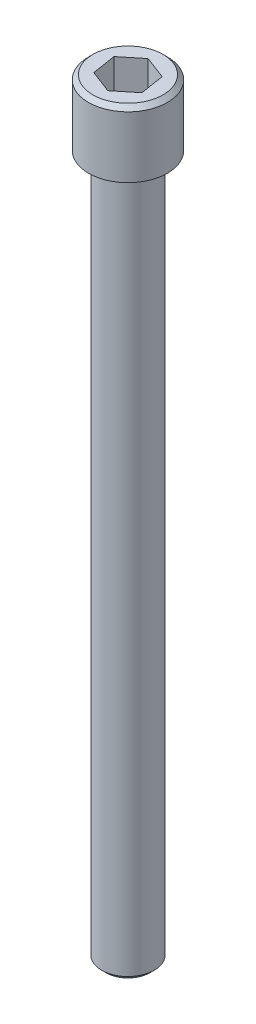
ISO-10303-21;
HEADER;
FILE_DESCRIPTION(('STEP AP214'),'2;1');
FILE_NAME('part.step','',(''),(''),'','','');
FILE_SCHEMA(('AUTOMOTIVE_DESIGN { 1 0 10303 214 1 1 1 1 }'));
ENDSEC;
DATA;
#1=APPLICATION_CONTEXT('core data for automotive mechanical design processes');
#2=APPLICATION_PROTOCOL_DEFINITION('international standard','automotive_design',2000,#1);
#3=PRODUCT_CONTEXT('',#1,'mechanical');
#4=PRODUCT('Part','Part','',(#3));
#5=PRODUCT_RELATED_PRODUCT_CATEGORY('part','',(#4));
#6=PRODUCT_DEFINITION_FORMATION('','',#4);
#7=PRODUCT_DEFINITION_CONTEXT('part definition',#1,'design');
#8=PRODUCT_DEFINITION('design','',#6,#7);
#9=PRODUCT_DEFINITION_SHAPE('','',#8);
#10=(LENGTH_UNIT() NAMED_UNIT(*) SI_UNIT(.MILLI.,.METRE.));
#11=(NAMED_UNIT(*) PLANE_ANGLE_UNIT() SI_UNIT($,.RADIAN.));
#12=(NAMED_UNIT(*) SI_UNIT($,.STERADIAN.) SOLID_ANGLE_UNIT());
#13=UNCERTAINTY_MEASURE_WITH_UNIT(LENGTH_MEASURE(1.E-05),#10,'distance_accuracy_value','');
#14=(GEOMETRIC_REPRESENTATION_CONTEXT(3) GLOBAL_UNCERTAINTY_ASSIGNED_CONTEXT((#13)) GLOBAL_UNIT_ASSIGNED_CONTEXT((#10,
#11,#12)) REPRESENTATION_CONTEXT('',''));
#15=CARTESIAN_POINT('',(0.,0.,0.));
#16=DIRECTION('',(0.,0.,1.));
#17=DIRECTION('',(1.,0.,0.));
#18=AXIS2_PLACEMENT_3D('',#15,#16,#17);
#19=CARTESIAN_POINT('',(0.,40.,0.));
#20=DIRECTION('',(0.,-1.,0.));
#21=DIRECTION('',(0.,0.,-1.));
#22=AXIS2_PLACEMENT_3D('',#19,#20,#21);
#23=CYLINDRICAL_SURFACE('',#22,1.5);
#24=CARTESIAN_POINT('',(0.,0.25,0.));
#25=DIRECTION('',(0.,1.,0.));
#26=DIRECTION('',(0.,0.,1.));
#27=AXIS2_PLACEMENT_3D('',#24,#25,#26);
#28=CIRCLE('',#27,1.5);
#29=CARTESIAN_POINT('',(0.,0.25,1.5));
#30=VERTEX_POINT('',#29);
#31=EDGE_CURVE('E41',#30,#30,#28,.T.);
#32=ORIENTED_EDGE('',*,*,#31,.T.);
#33=EDGE_LOOP('',(#32));
#34=FACE_BOUND('',#33,.T.);
#35=CARTESIAN_POINT('',(0.,40.,0.));
#36=DIRECTION('',(0.,1.,0.));
#37=DIRECTION('',(0.,0.,1.));
#38=AXIS2_PLACEMENT_3D('',#35,#36,#37);
#39=CIRCLE('',#38,1.5);
#40=CARTESIAN_POINT('',(0.,40.,1.5));
#41=VERTEX_POINT('',#40);
#42=EDGE_CURVE('E143',#41,#41,#39,.T.);
#43=ORIENTED_EDGE('',*,*,#42,.F.);
#44=EDGE_LOOP('',(#43));
#45=FACE_BOUND('',#44,.T.);
#46=ADVANCED_FACE('F33',(#34,#45),#23,.T.);
#47=CARTESIAN_POINT('',(0.,0.,0.));
#48=DIRECTION('',(0.,1.,0.));
#49=DIRECTION('',(0.,0.,1.));
#50=AXIS2_PLACEMENT_3D('',#47,#48,#49);
#51=PLANE('',#50);
#52=CARTESIAN_POINT('',(0.,0.,0.));
#53=DIRECTION('',(0.,1.,0.));
#54=DIRECTION('',(0.,0.,1.));
#55=AXIS2_PLACEMENT_3D('',#52,#53,#54);
#56=CIRCLE('',#55,1.24999999999999);
#57=CARTESIAN_POINT('',(0.,0.,1.24999999999999));
#58=VERTEX_POINT('',#57);
#59=EDGE_CURVE('E11',#58,#58,#56,.F.);
#60=ORIENTED_EDGE('',*,*,#59,.T.);
#61=EDGE_LOOP('',(#60));
#62=FACE_BOUND('',#61,.T.);
#63=ADVANCED_FACE('F165',(#62),#51,.F.);
#64=CARTESIAN_POINT('',(0.,43.75,0.));
#65=DIRECTION('',(0.,-1.,0.));
#66=DIRECTION('',(0.,0.,-1.));
#67=AXIS2_PLACEMENT_3D('',#64,#65,#66);
#68=CYLINDRICAL_SURFACE('',#67,2.25);
#69=CARTESIAN_POINT('',(0.,43.5,0.));
#70=DIRECTION('',(0.,1.,0.));
#71=DIRECTION('',(0.,0.,1.));
#72=AXIS2_PLACEMENT_3D('',#69,#70,#71);
#73=CIRCLE('',#72,2.25);
#74=CARTESIAN_POINT('',(0.,43.5,2.25));
#75=VERTEX_POINT('',#74);
#76=EDGE_CURVE('E149',#75,#75,#73,.F.);
#77=ORIENTED_EDGE('',*,*,#76,.T.);
#78=EDGE_LOOP('',(#77));
#79=FACE_BOUND('',#78,.T.);
#80=CARTESIAN_POINT('',(0.,40.,0.));
#81=DIRECTION('',(0.,1.,0.));
#82=DIRECTION('',(0.,0.,1.));
#83=AXIS2_PLACEMENT_3D('',#80,#81,#82);
#84=CIRCLE('',#83,2.25);
#85=CARTESIAN_POINT('',(0.,40.,2.25));
#86=VERTEX_POINT('',#85);
#87=EDGE_CURVE('E135',#86,#86,#84,.T.);
#88=ORIENTED_EDGE('',*,*,#87,.T.);
#89=EDGE_LOOP('',(#88));
#90=FACE_BOUND('',#89,.T.);
#91=ADVANCED_FACE('F170',(#79,#90),#68,.T.);
#92=CARTESIAN_POINT('',(0.,43.75,0.));
#93=DIRECTION('',(0.,1.,0.));
#94=DIRECTION('',(0.,0.,1.));
#95=AXIS2_PLACEMENT_3D('',#92,#93,#94);
#96=PLANE('',#95);
#97=CARTESIAN_POINT('',(0.,43.75,0.));
#98=DIRECTION('',(0.,1.,0.));
#99=DIRECTION('',(0.,0.,1.));
#100=AXIS2_PLACEMENT_3D('',#97,#98,#99);
#101=CIRCLE('',#100,2.00000000000001);
#102=CARTESIAN_POINT('',(0.,43.75,2.00000000000001));
#103=VERTEX_POINT('',#102);
#104=EDGE_CURVE('E146',#103,#103,#101,.T.);
#105=ORIENTED_EDGE('',*,*,#104,.T.);
#106=EDGE_LOOP('',(#105));
#107=FACE_BOUND('',#106,.T.);
#108=DIRECTION('',(0.159195520088402,0.,0.987247074639263));
#109=VECTOR('',#108,1.);
#110=CARTESIAN_POINT('',(-1.2949903812193,43.75,-0.492950213053497));
#111=LINE('',#110,#109);
#112=CARTESIAN_POINT('',(-1.2949903812193,43.75,-0.492950213053497));
#113=VERTEX_POINT('',#112);
#114=CARTESIAN_POINT('',(-1.07440259791493,43.75,0.875019461265662));
#115=VERTEX_POINT('',#114);
#116=EDGE_CURVE('E48',#113,#115,#111,.T.);
#117=ORIENTED_EDGE('',*,*,#116,.F.);
#118=DIRECTION('',(-0.775383286405273,0.,0.631490901884864));
#119=VECTOR('',#118,1.);
#120=CARTESIAN_POINT('',(-0.220587783304371,43.75,-1.36796967431916));
#121=LINE('',#120,#119);
#122=CARTESIAN_POINT('',(-0.220587783304371,43.75,-1.36796967431916));
#123=VERTEX_POINT('',#122);
#124=EDGE_CURVE('E131',#123,#113,#121,.T.);
#125=ORIENTED_EDGE('',*,*,#124,.F.);
#126=DIRECTION('',(-0.934578806493675,0.,-0.3557561727544));
#127=VECTOR('',#126,1.);
#128=CARTESIAN_POINT('',(1.07440259791493,43.75,-0.875019461265662));
#129=LINE('',#128,#127);
#130=CARTESIAN_POINT('',(1.07440259791493,43.75,-0.875019461265662));
#131=VERTEX_POINT('',#130);
#132=EDGE_CURVE('E129',#131,#123,#129,.T.);
#133=ORIENTED_EDGE('',*,*,#132,.F.);
#134=DIRECTION('',(-0.159195520088402,0.,-0.987247074639263));
#135=VECTOR('',#134,1.);
#136=CARTESIAN_POINT('',(1.2949903812193,43.75,0.492950213053496));
#137=LINE('',#136,#135);
#138=CARTESIAN_POINT('',(1.2949903812193,43.75,0.492950213053496));
#139=VERTEX_POINT('',#138);
#140=EDGE_CURVE('E96',#139,#131,#137,.T.);
#141=ORIENTED_EDGE('',*,*,#140,.F.);
#142=DIRECTION('',(0.775383286405273,0.,-0.631490901884864));
#143=VECTOR('',#142,1.);
#144=CARTESIAN_POINT('',(0.220587783304371,43.75,1.36796967431916));
#145=LINE('',#144,#143);
#146=CARTESIAN_POINT('',(0.220587783304371,43.75,1.36796967431916));
#147=VERTEX_POINT('',#146);
#148=EDGE_CURVE('E125',#147,#139,#145,.T.);
#149=ORIENTED_EDGE('',*,*,#148,.F.);
#150=DIRECTION('',(0.934578806493675,0.,0.3557561727544));
#151=VECTOR('',#150,1.);
#152=CARTESIAN_POINT('',(-1.07440259791493,43.75,0.875019461265662));
#153=LINE('',#152,#151);
#154=EDGE_CURVE('E122',#115,#147,#153,.T.);
#155=ORIENTED_EDGE('',*,*,#154,.F.);
#156=EDGE_LOOP('',(#117,#125,#133,#141,#149,#155));
#157=FACE_BOUND('',#156,.T.);
#158=ADVANCED_FACE('F176',(#107,#157),#96,.T.);
#159=CARTESIAN_POINT('',(0.,40.,0.));
#160=DIRECTION('',(0.,1.,0.));
#161=DIRECTION('',(0.,0.,1.));
#162=AXIS2_PLACEMENT_3D('',#159,#160,#161);
#163=PLANE('',#162);
#164=ORIENTED_EDGE('',*,*,#42,.T.);
#165=EDGE_LOOP('',(#164));
#166=FACE_BOUND('',#165,.T.);
#167=ORIENTED_EDGE('',*,*,#87,.F.);
#168=EDGE_LOOP('',(#167));
#169=FACE_BOUND('',#168,.T.);
#170=ADVANCED_FACE('F178',(#166,#169),#163,.F.);
#171=CARTESIAN_POINT('',(-1.2949903812193,41.5,-0.492950213053497));
#172=DIRECTION('',(-0.987247074639263,0.,0.159195520088402));
#173=DIRECTION('',(0.159195520088402,0.,0.987247074639263));
#174=AXIS2_PLACEMENT_3D('',#171,#172,#173);
#175=PLANE('',#174);
#176=ORIENTED_EDGE('',*,*,#116,.T.);
#177=DIRECTION('',(0.,1.,0.));
#178=VECTOR('',#177,1.);
#179=CARTESIAN_POINT('',(-1.07440259791493,41.5,0.875019461265662));
#180=LINE('',#179,#178);
#181=CARTESIAN_POINT('',(-1.07440259791493,41.5,0.875019461265662));
#182=VERTEX_POINT('',#181);
#183=EDGE_CURVE('E78',#182,#115,#180,.T.);
#184=ORIENTED_EDGE('',*,*,#183,.F.);
#185=DIRECTION('',(0.159195520088402,0.,0.987247074639263));
#186=VECTOR('',#185,1.);
#187=CARTESIAN_POINT('',(-1.2949903812193,41.5,-0.492950213053497));
#188=LINE('',#187,#186);
#189=CARTESIAN_POINT('',(-1.2949903812193,41.5,-0.492950213053497));
#190=VERTEX_POINT('',#189);
#191=EDGE_CURVE('E133',#190,#182,#188,.T.);
#192=ORIENTED_EDGE('',*,*,#191,.F.);
#193=DIRECTION('',(0.,1.,0.));
#194=VECTOR('',#193,1.);
#195=CARTESIAN_POINT('',(-1.2949903812193,41.5,-0.492950213053497));
#196=LINE('',#195,#194);
#197=EDGE_CURVE('E56',#190,#113,#196,.T.);
#198=ORIENTED_EDGE('',*,*,#197,.T.);
#199=EDGE_LOOP('',(#176,#184,#192,#198));
#200=FACE_BOUND('',#199,.T.);
#201=ADVANCED_FACE('F181',(#200),#175,.F.);
#202=CARTESIAN_POINT('',(-0.220587783304371,41.5,-1.36796967431916));
#203=DIRECTION('',(-0.631490901884864,0.,-0.775383286405273));
#204=DIRECTION('',(-0.775383286405273,0.,0.631490901884864));
#205=AXIS2_PLACEMENT_3D('',#202,#203,#204);
#206=PLANE('',#205);
#207=ORIENTED_EDGE('',*,*,#124,.T.);
#208=ORIENTED_EDGE('',*,*,#197,.F.);
#209=DIRECTION('',(-0.775383286405273,0.,0.631490901884864));
#210=VECTOR('',#209,1.);
#211=CARTESIAN_POINT('',(-0.220587783304371,41.5,-1.36796967431916));
#212=LINE('',#211,#210);
#213=CARTESIAN_POINT('',(-0.220587783304371,41.5,-1.36796967431916));
#214=VERTEX_POINT('',#213);
#215=EDGE_CURVE('E108',#214,#190,#212,.T.);
#216=ORIENTED_EDGE('',*,*,#215,.F.);
#217=DIRECTION('',(0.,1.,0.));
#218=VECTOR('',#217,1.);
#219=CARTESIAN_POINT('',(-0.220587783304371,41.5,-1.36796967431916));
#220=LINE('',#219,#218);
#221=EDGE_CURVE('E100',#214,#123,#220,.T.);
#222=ORIENTED_EDGE('',*,*,#221,.T.);
#223=EDGE_LOOP('',(#207,#208,#216,#222));
#224=FACE_BOUND('',#223,.T.);
#225=ADVANCED_FACE('F188',(#224),#206,.F.);
#226=CARTESIAN_POINT('',(1.07440259791493,41.5,-0.875019461265662));
#227=DIRECTION('',(0.3557561727544,0.,-0.934578806493675));
#228=DIRECTION('',(-0.934578806493675,0.,-0.3557561727544));
#229=AXIS2_PLACEMENT_3D('',#226,#227,#228);
#230=PLANE('',#229);
#231=ORIENTED_EDGE('',*,*,#132,.T.);
#232=ORIENTED_EDGE('',*,*,#221,.F.);
#233=DIRECTION('',(-0.934578806493675,0.,-0.3557561727544));
#234=VECTOR('',#233,1.);
#235=CARTESIAN_POINT('',(1.07440259791493,41.5,-0.875019461265662));
#236=LINE('',#235,#234);
#237=CARTESIAN_POINT('',(1.07440259791493,41.5,-0.875019461265662));
#238=VERTEX_POINT('',#237);
#239=EDGE_CURVE('E104',#238,#214,#236,.T.);
#240=ORIENTED_EDGE('',*,*,#239,.F.);
#241=DIRECTION('',(0.,1.,0.));
#242=VECTOR('',#241,1.);
#243=CARTESIAN_POINT('',(1.07440259791493,41.5,-0.875019461265662));
#244=LINE('',#243,#242);
#245=EDGE_CURVE('E89',#238,#131,#244,.T.);
#246=ORIENTED_EDGE('',*,*,#245,.T.);
#247=EDGE_LOOP('',(#231,#232,#240,#246));
#248=FACE_BOUND('',#247,.T.);
#249=ADVANCED_FACE('F105',(#248),#230,.F.);
#250=CARTESIAN_POINT('',(1.2949903812193,41.5,0.492950213053496));
#251=DIRECTION('',(0.987247074639263,0.,-0.159195520088402));
#252=DIRECTION('',(-0.159195520088403,0.,-0.987247074639263));
#253=AXIS2_PLACEMENT_3D('',#250,#251,#252);
#254=PLANE('',#253);
#255=ORIENTED_EDGE('',*,*,#140,.T.);
#256=ORIENTED_EDGE('',*,*,#245,.F.);
#257=DIRECTION('',(-0.159195520088402,0.,-0.987247074639263));
#258=VECTOR('',#257,1.);
#259=CARTESIAN_POINT('',(1.2949903812193,41.5,0.492950213053496));
#260=LINE('',#259,#258);
#261=CARTESIAN_POINT('',(1.2949903812193,41.5,0.492950213053496));
#262=VERTEX_POINT('',#261);
#263=EDGE_CURVE('E93',#262,#238,#260,.T.);
#264=ORIENTED_EDGE('',*,*,#263,.F.);
#265=DIRECTION('',(0.,1.,0.));
#266=VECTOR('',#265,1.);
#267=CARTESIAN_POINT('',(1.2949903812193,41.5,0.492950213053496));
#268=LINE('',#267,#266);
#269=EDGE_CURVE('E101',#262,#139,#268,.T.);
#270=ORIENTED_EDGE('',*,*,#269,.T.);
#271=EDGE_LOOP('',(#255,#256,#264,#270));
#272=FACE_BOUND('',#271,.T.);
#273=ADVANCED_FACE('F91',(#272),#254,.F.);
#274=CARTESIAN_POINT('',(0.220587783304371,41.5,1.36796967431916));
#275=DIRECTION('',(0.631490901884864,0.,0.775383286405273));
#276=DIRECTION('',(0.775383286405273,0.,-0.631490901884864));
#277=AXIS2_PLACEMENT_3D('',#274,#275,#276);
#278=PLANE('',#277);
#279=ORIENTED_EDGE('',*,*,#148,.T.);
#280=ORIENTED_EDGE('',*,*,#269,.F.);
#281=DIRECTION('',(0.775383286405273,0.,-0.631490901884864));
#282=VECTOR('',#281,1.);
#283=CARTESIAN_POINT('',(0.220587783304371,41.5,1.36796967431916));
#284=LINE('',#283,#282);
#285=CARTESIAN_POINT('',(0.220587783304371,41.5,1.36796967431916));
#286=VERTEX_POINT('',#285);
#287=EDGE_CURVE('E114',#286,#262,#284,.T.);
#288=ORIENTED_EDGE('',*,*,#287,.F.);
#289=DIRECTION('',(0.,1.,0.));
#290=VECTOR('',#289,1.);
#291=CARTESIAN_POINT('',(0.220587783304371,41.5,1.36796967431916));
#292=LINE('',#291,#290);
#293=EDGE_CURVE('E138',#286,#147,#292,.T.);
#294=ORIENTED_EDGE('',*,*,#293,.T.);
#295=EDGE_LOOP('',(#279,#280,#288,#294));
#296=FACE_BOUND('',#295,.T.);
#297=ADVANCED_FACE('F192',(#296),#278,.F.);
#298=CARTESIAN_POINT('',(-1.07440259791493,41.5,0.875019461265662));
#299=DIRECTION('',(-0.3557561727544,0.,0.934578806493675));
#300=DIRECTION('',(0.934578806493675,0.,0.3557561727544));
#301=AXIS2_PLACEMENT_3D('',#298,#299,#300);
#302=PLANE('',#301);
#303=ORIENTED_EDGE('',*,*,#154,.T.);
#304=ORIENTED_EDGE('',*,*,#293,.F.);
#305=DIRECTION('',(0.934578806493675,0.,0.3557561727544));
#306=VECTOR('',#305,1.);
#307=CARTESIAN_POINT('',(-1.07440259791493,41.5,0.875019461265662));
#308=LINE('',#307,#306);
#309=EDGE_CURVE('E116',#182,#286,#308,.T.);
#310=ORIENTED_EDGE('',*,*,#309,.F.);
#311=ORIENTED_EDGE('',*,*,#183,.T.);
#312=EDGE_LOOP('',(#303,#304,#310,#311));
#313=FACE_BOUND('',#312,.T.);
#314=ADVANCED_FACE('F189',(#313),#302,.F.);
#315=CARTESIAN_POINT('',(0.,41.5,0.));
#316=DIRECTION('',(0.,1.,0.));
#317=DIRECTION('',(0.,0.,1.));
#318=AXIS2_PLACEMENT_3D('',#315,#316,#317);
#319=PLANE('',#318);
#320=ORIENTED_EDGE('',*,*,#191,.T.);
#321=ORIENTED_EDGE('',*,*,#309,.T.);
#322=ORIENTED_EDGE('',*,*,#287,.T.);
#323=ORIENTED_EDGE('',*,*,#263,.T.);
#324=ORIENTED_EDGE('',*,*,#239,.T.);
#325=ORIENTED_EDGE('',*,*,#215,.T.);
#326=EDGE_LOOP('',(#320,#321,#322,#323,#324,#325));
#327=FACE_BOUND('',#326,.T.);
#328=ADVANCED_FACE('F111',(#327),#319,.T.);
#329=CARTESIAN_POINT('',(0.,43.75,0.));
#330=DIRECTION('',(0.,-1.,0.));
#331=DIRECTION('',(0.,0.,-1.));
#332=AXIS2_PLACEMENT_3D('',#329,#330,#331);
#333=CONICAL_SURFACE('',#332,2.00000000000001,0.785398163397444);
#334=ORIENTED_EDGE('',*,*,#76,.F.);
#335=EDGE_LOOP('',(#334));
#336=FACE_BOUND('',#335,.T.);
#337=ORIENTED_EDGE('',*,*,#104,.F.);
#338=EDGE_LOOP('',(#337));
#339=FACE_BOUND('',#338,.T.);
#340=ADVANCED_FACE('F157',(#336,#339),#333,.T.);
#341=CARTESIAN_POINT('',(0.,0.25,0.));
#342=DIRECTION('',(0.,1.,0.));
#343=DIRECTION('',(0.,0.,1.));
#344=AXIS2_PLACEMENT_3D('',#341,#342,#343);
#345=CONICAL_SURFACE('',#344,1.5,0.785398163397459);
#346=ORIENTED_EDGE('',*,*,#59,.F.);
#347=EDGE_LOOP('',(#346));
#348=FACE_BOUND('',#347,.T.);
#349=ORIENTED_EDGE('',*,*,#31,.F.);
#350=EDGE_LOOP('',(#349));
#351=FACE_BOUND('',#350,.T.);
#352=ADVANCED_FACE('F35',(#348,#351),#345,.T.);
#353=CLOSED_SHELL('',(#46,#63,#91,#158,#170,#201,#225,#249,#273,#297,#314,#328,#340,#352));
#354=MANIFOLD_SOLID_BREP('B2',#353);
#355=ADVANCED_BREP_SHAPE_REPRESENTATION('',(#18,#354),#14);
#356=SHAPE_DEFINITION_REPRESENTATION(#9,#355);
ENDSEC;
END-ISO-10303-21;
